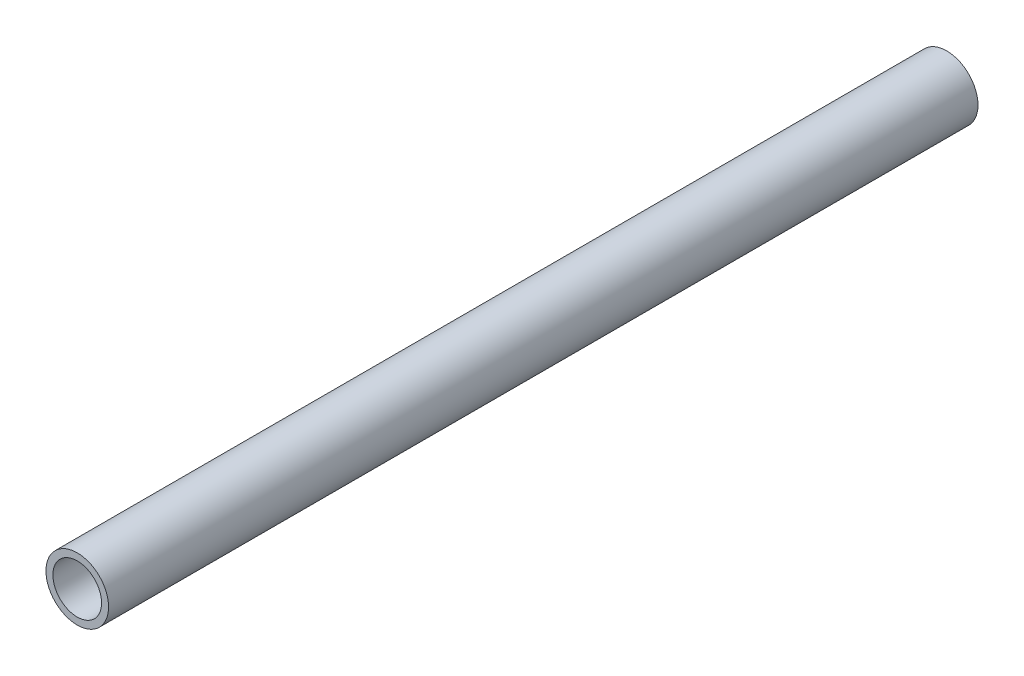
ISO-10303-21;
HEADER;
FILE_DESCRIPTION(('STEP AP214'),'2;1');
FILE_NAME('part.step','',(''),(''),'','','');
FILE_SCHEMA(('AUTOMOTIVE_DESIGN { 1 0 10303 214 1 1 1 1 }'));
ENDSEC;
DATA;
#1=APPLICATION_CONTEXT('core data for automotive mechanical design processes');
#2=APPLICATION_PROTOCOL_DEFINITION('international standard','automotive_design',2000,#1);
#3=PRODUCT_CONTEXT('',#1,'mechanical');
#4=PRODUCT('Part','Part','',(#3));
#5=PRODUCT_RELATED_PRODUCT_CATEGORY('part','',(#4));
#6=PRODUCT_DEFINITION_FORMATION('','',#4);
#7=PRODUCT_DEFINITION_CONTEXT('part definition',#1,'design');
#8=PRODUCT_DEFINITION('design','',#6,#7);
#9=PRODUCT_DEFINITION_SHAPE('','',#8);
#10=(LENGTH_UNIT() NAMED_UNIT(*) SI_UNIT(.MILLI.,.METRE.));
#11=(NAMED_UNIT(*) PLANE_ANGLE_UNIT() SI_UNIT($,.RADIAN.));
#12=(NAMED_UNIT(*) SI_UNIT($,.STERADIAN.) SOLID_ANGLE_UNIT());
#13=UNCERTAINTY_MEASURE_WITH_UNIT(LENGTH_MEASURE(1.E-05),#10,'distance_accuracy_value','');
#14=(GEOMETRIC_REPRESENTATION_CONTEXT(3) GLOBAL_UNCERTAINTY_ASSIGNED_CONTEXT((#13)) GLOBAL_UNIT_ASSIGNED_CONTEXT((#10,
#11,#12)) REPRESENTATION_CONTEXT('',''));
#15=CARTESIAN_POINT('',(0.,0.,0.));
#16=DIRECTION('',(0.,0.,1.));
#17=DIRECTION('',(1.,0.,0.));
#18=AXIS2_PLACEMENT_3D('',#15,#16,#17);
#19=CARTESIAN_POINT('',(0.,0.,150.));
#20=DIRECTION('',(0.,0.,-1.));
#21=DIRECTION('',(-1.,0.,0.));
#22=AXIS2_PLACEMENT_3D('',#19,#20,#21);
#23=CYLINDRICAL_SURFACE('',#22,4.5);
#24=CARTESIAN_POINT('',(0.,0.,-150.));
#25=DIRECTION('',(0.,0.,1.));
#26=DIRECTION('',(1.,0.,0.));
#27=AXIS2_PLACEMENT_3D('',#24,#25,#26);
#28=CIRCLE('',#27,4.5);
#29=CARTESIAN_POINT('',(4.5,0.,-150.));
#30=VERTEX_POINT('',#29);
#31=EDGE_CURVE('E10',#30,#30,#28,.T.);
#32=ORIENTED_EDGE('',*,*,#31,.T.);
#33=EDGE_LOOP('',(#32));
#34=FACE_BOUND('',#33,.T.);
#35=CARTESIAN_POINT('',(0.,0.,-25.));
#36=DIRECTION('',(0.,0.,1.));
#37=DIRECTION('',(1.,0.,0.));
#38=AXIS2_PLACEMENT_3D('',#35,#36,#37);
#39=CIRCLE('',#38,4.5);
#40=CARTESIAN_POINT('',(4.5,0.,-25.));
#41=VERTEX_POINT('',#40);
#42=EDGE_CURVE('E53',#41,#41,#39,.T.);
#43=ORIENTED_EDGE('',*,*,#42,.F.);
#44=EDGE_LOOP('',(#43));
#45=FACE_BOUND('',#44,.T.);
#46=ADVANCED_FACE('F40',(#34,#45),#23,.T.);
#47=CARTESIAN_POINT('',(0.,0.,150.));
#48=DIRECTION('',(0.,0.,-1.));
#49=DIRECTION('',(-1.,0.,0.));
#50=AXIS2_PLACEMENT_3D('',#47,#48,#49);
#51=CYLINDRICAL_SURFACE('',#50,3.5);
#52=CARTESIAN_POINT('',(0.,0.,-150.));
#53=DIRECTION('',(0.,0.,1.));
#54=DIRECTION('',(1.,0.,0.));
#55=AXIS2_PLACEMENT_3D('',#52,#53,#54);
#56=CIRCLE('',#55,3.5);
#57=CARTESIAN_POINT('',(3.5,0.,-150.));
#58=VERTEX_POINT('',#57);
#59=EDGE_CURVE('E47',#58,#58,#56,.T.);
#60=ORIENTED_EDGE('',*,*,#59,.F.);
#61=EDGE_LOOP('',(#60));
#62=FACE_BOUND('',#61,.T.);
#63=CARTESIAN_POINT('',(0.,0.,-25.));
#64=DIRECTION('',(0.,0.,1.));
#65=DIRECTION('',(1.,0.,0.));
#66=AXIS2_PLACEMENT_3D('',#63,#64,#65);
#67=CIRCLE('',#66,3.5);
#68=CARTESIAN_POINT('',(3.5,0.,-25.));
#69=VERTEX_POINT('',#68);
#70=EDGE_CURVE('E43',#69,#69,#67,.T.);
#71=ORIENTED_EDGE('',*,*,#70,.T.);
#72=EDGE_LOOP('',(#71));
#73=FACE_BOUND('',#72,.T.);
#74=ADVANCED_FACE('F60',(#62,#73),#51,.F.);
#75=CARTESIAN_POINT('',(0.,0.,-150.));
#76=DIRECTION('',(0.,0.,1.));
#77=DIRECTION('',(1.,0.,0.));
#78=AXIS2_PLACEMENT_3D('',#75,#76,#77);
#79=PLANE('',#78);
#80=ORIENTED_EDGE('',*,*,#31,.F.);
#81=EDGE_LOOP('',(#80));
#82=FACE_BOUND('',#81,.T.);
#83=ORIENTED_EDGE('',*,*,#59,.T.);
#84=EDGE_LOOP('',(#83));
#85=FACE_BOUND('',#84,.T.);
#86=ADVANCED_FACE('F64',(#82,#85),#79,.F.);
#87=CARTESIAN_POINT('',(0.,0.,-25.));
#88=DIRECTION('',(0.,0.,1.));
#89=DIRECTION('',(1.,0.,0.));
#90=AXIS2_PLACEMENT_3D('',#87,#88,#89);
#91=PLANE('',#90);
#92=ORIENTED_EDGE('',*,*,#70,.F.);
#93=EDGE_LOOP('',(#92));
#94=FACE_BOUND('',#93,.T.);
#95=ORIENTED_EDGE('',*,*,#42,.T.);
#96=EDGE_LOOP('',(#95));
#97=FACE_BOUND('',#96,.T.);
#98=ADVANCED_FACE('F62',(#94,#97),#91,.T.);
#99=CLOSED_SHELL('',(#46,#74,#86,#98));
#100=MANIFOLD_SOLID_BREP('B2',#99);
#101=ADVANCED_BREP_SHAPE_REPRESENTATION('',(#18,#100),#14);
#102=SHAPE_DEFINITION_REPRESENTATION(#9,#101);
ENDSEC;
END-ISO-10303-21;
